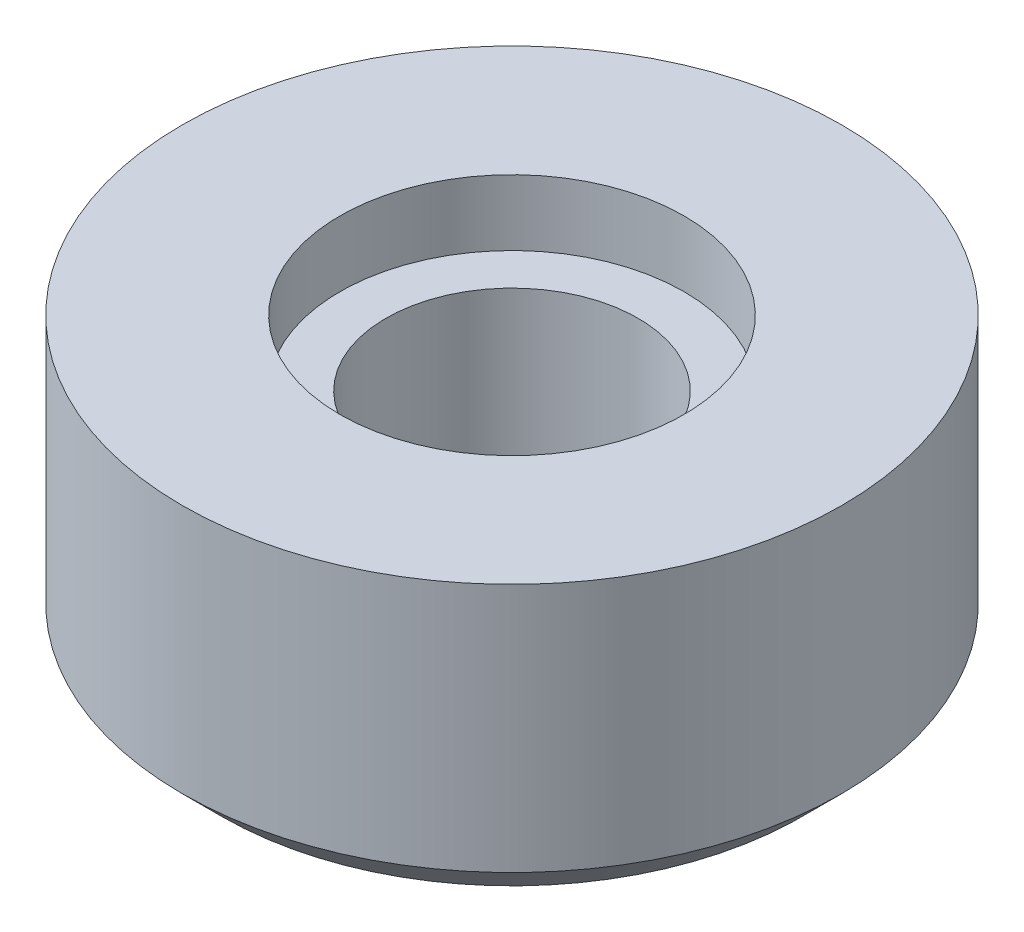
ISO-10303-21;
HEADER;
FILE_DESCRIPTION(('STEP AP214'),'2;1');
FILE_NAME('part.step','',(''),(''),'','','');
FILE_SCHEMA(('AUTOMOTIVE_DESIGN { 1 0 10303 214 1 1 1 1 }'));
ENDSEC;
DATA;
#1=APPLICATION_CONTEXT('core data for automotive mechanical design processes');
#2=APPLICATION_PROTOCOL_DEFINITION('international standard','automotive_design',2000,#1);
#3=PRODUCT_CONTEXT('',#1,'mechanical');
#4=PRODUCT('Part','Part','',(#3));
#5=PRODUCT_RELATED_PRODUCT_CATEGORY('part','',(#4));
#6=PRODUCT_DEFINITION_FORMATION('','',#4);
#7=PRODUCT_DEFINITION_CONTEXT('part definition',#1,'design');
#8=PRODUCT_DEFINITION('design','',#6,#7);
#9=PRODUCT_DEFINITION_SHAPE('','',#8);
#10=(LENGTH_UNIT() NAMED_UNIT(*) SI_UNIT(.MILLI.,.METRE.));
#11=(NAMED_UNIT(*) PLANE_ANGLE_UNIT() SI_UNIT($,.RADIAN.));
#12=(NAMED_UNIT(*) SI_UNIT($,.STERADIAN.) SOLID_ANGLE_UNIT());
#13=UNCERTAINTY_MEASURE_WITH_UNIT(LENGTH_MEASURE(1.E-05),#10,'distance_accuracy_value','');
#14=(GEOMETRIC_REPRESENTATION_CONTEXT(3) GLOBAL_UNCERTAINTY_ASSIGNED_CONTEXT((#13)) GLOBAL_UNIT_ASSIGNED_CONTEXT((#10,
#11,#12)) REPRESENTATION_CONTEXT('',''));
#15=CARTESIAN_POINT('',(0.,0.,0.));
#16=DIRECTION('',(0.,0.,1.));
#17=DIRECTION('',(1.,0.,0.));
#18=AXIS2_PLACEMENT_3D('',#15,#16,#17);
#19=CARTESIAN_POINT('',(0.,14.4550387124949,0.));
#20=DIRECTION('',(0.,1.,0.));
#21=DIRECTION('',(0.,0.,1.));
#22=AXIS2_PLACEMENT_3D('',#19,#20,#21);
#23=CYLINDRICAL_SURFACE('',#22,4.8);
#24=CARTESIAN_POINT('',(0.,0.,0.));
#25=DIRECTION('',(0.,1.,0.));
#26=DIRECTION('',(0.,0.,1.));
#27=AXIS2_PLACEMENT_3D('',#24,#25,#26);
#28=CIRCLE('',#27,4.8);
#29=CARTESIAN_POINT('',(0.,0.,4.8));
#30=VERTEX_POINT('',#29);
#31=EDGE_CURVE('E10',#30,#30,#28,.T.);
#32=ORIENTED_EDGE('',*,*,#31,.F.);
#33=EDGE_LOOP('',(#32));
#34=FACE_BOUND('',#33,.T.);
#35=CARTESIAN_POINT('',(0.,8.5,0.));
#36=DIRECTION('',(0.,1.,0.));
#37=DIRECTION('',(0.,0.,1.));
#38=AXIS2_PLACEMENT_3D('',#35,#36,#37);
#39=CIRCLE('',#38,4.8);
#40=CARTESIAN_POINT('',(0.,8.5,4.8));
#41=VERTEX_POINT('',#40);
#42=EDGE_CURVE('E59',#41,#41,#39,.T.);
#43=ORIENTED_EDGE('',*,*,#42,.T.);
#44=EDGE_LOOP('',(#43));
#45=FACE_BOUND('',#44,.T.);
#46=ADVANCED_FACE('F34',(#34,#45),#23,.F.);
#47=CARTESIAN_POINT('',(4.8,0.,0.));
#48=DIRECTION('',(0.,1.,0.));
#49=DIRECTION('',(0.,0.,1.));
#50=AXIS2_PLACEMENT_3D('',#47,#48,#49);
#51=PLANE('',#50);
#52=CARTESIAN_POINT('',(0.,0.,0.));
#53=DIRECTION('',(0.,1.,0.));
#54=DIRECTION('',(0.,0.,1.));
#55=AXIS2_PLACEMENT_3D('',#52,#53,#54);
#56=CIRCLE('',#55,11.05);
#57=CARTESIAN_POINT('',(0.,0.,11.05));
#58=VERTEX_POINT('',#57);
#59=EDGE_CURVE('E40',#58,#58,#56,.T.);
#60=ORIENTED_EDGE('',*,*,#59,.F.);
#61=EDGE_LOOP('',(#60));
#62=FACE_BOUND('',#61,.T.);
#63=ORIENTED_EDGE('',*,*,#31,.T.);
#64=EDGE_LOOP('',(#63));
#65=FACE_BOUND('',#64,.T.);
#66=ADVANCED_FACE('F90',(#62,#65),#51,.F.);
#67=CARTESIAN_POINT('',(0.,0.,0.));
#68=DIRECTION('',(0.,1.,0.));
#69=DIRECTION('',(0.,0.,1.));
#70=AXIS2_PLACEMENT_3D('',#67,#68,#69);
#71=CONICAL_SURFACE('',#70,11.05,0.785398163397448);
#72=CARTESIAN_POINT('',(0.,1.5,0.));
#73=DIRECTION('',(0.,1.,0.));
#74=DIRECTION('',(0.,0.,1.));
#75=AXIS2_PLACEMENT_3D('',#72,#73,#74);
#76=CIRCLE('',#75,12.55);
#77=CARTESIAN_POINT('',(0.,1.5,12.55));
#78=VERTEX_POINT('',#77);
#79=EDGE_CURVE('E44',#78,#78,#76,.T.);
#80=ORIENTED_EDGE('',*,*,#79,.F.);
#81=EDGE_LOOP('',(#80));
#82=FACE_BOUND('',#81,.T.);
#83=ORIENTED_EDGE('',*,*,#59,.T.);
#84=EDGE_LOOP('',(#83));
#85=FACE_BOUND('',#84,.T.);
#86=ADVANCED_FACE('F85',(#82,#85),#71,.T.);
#87=CARTESIAN_POINT('',(0.,14.4550387124949,0.));
#88=DIRECTION('',(0.,1.,0.));
#89=DIRECTION('',(0.,0.,1.));
#90=AXIS2_PLACEMENT_3D('',#87,#88,#89);
#91=CYLINDRICAL_SURFACE('',#90,12.55);
#92=CARTESIAN_POINT('',(0.,11.,0.));
#93=DIRECTION('',(0.,1.,0.));
#94=DIRECTION('',(0.,0.,1.));
#95=AXIS2_PLACEMENT_3D('',#92,#93,#94);
#96=CIRCLE('',#95,12.55);
#97=CARTESIAN_POINT('',(0.,11.,12.55));
#98=VERTEX_POINT('',#97);
#99=EDGE_CURVE('E48',#98,#98,#96,.T.);
#100=ORIENTED_EDGE('',*,*,#99,.F.);
#101=EDGE_LOOP('',(#100));
#102=FACE_BOUND('',#101,.T.);
#103=ORIENTED_EDGE('',*,*,#79,.T.);
#104=EDGE_LOOP('',(#103));
#105=FACE_BOUND('',#104,.T.);
#106=ADVANCED_FACE('F79',(#102,#105),#91,.T.);
#107=CARTESIAN_POINT('',(12.55,11.,0.));
#108=DIRECTION('',(0.,-1.,0.));
#109=DIRECTION('',(0.,0.,-1.));
#110=AXIS2_PLACEMENT_3D('',#107,#108,#109);
#111=PLANE('',#110);
#112=CARTESIAN_POINT('',(0.,11.,0.));
#113=DIRECTION('',(0.,1.,0.));
#114=DIRECTION('',(0.,0.,1.));
#115=AXIS2_PLACEMENT_3D('',#112,#113,#114);
#116=CIRCLE('',#115,6.55);
#117=CARTESIAN_POINT('',(0.,11.,6.55));
#118=VERTEX_POINT('',#117);
#119=EDGE_CURVE('E53',#118,#118,#116,.T.);
#120=ORIENTED_EDGE('',*,*,#119,.F.);
#121=EDGE_LOOP('',(#120));
#122=FACE_BOUND('',#121,.T.);
#123=ORIENTED_EDGE('',*,*,#99,.T.);
#124=EDGE_LOOP('',(#123));
#125=FACE_BOUND('',#124,.T.);
#126=ADVANCED_FACE('F73',(#122,#125),#111,.F.);
#127=CARTESIAN_POINT('',(0.,14.4550387124949,0.));
#128=DIRECTION('',(0.,1.,0.));
#129=DIRECTION('',(0.,0.,1.));
#130=AXIS2_PLACEMENT_3D('',#127,#128,#129);
#131=CYLINDRICAL_SURFACE('',#130,6.55);
#132=CARTESIAN_POINT('',(0.,8.5,0.));
#133=DIRECTION('',(0.,1.,0.));
#134=DIRECTION('',(0.,0.,1.));
#135=AXIS2_PLACEMENT_3D('',#132,#133,#134);
#136=CIRCLE('',#135,6.54999999999999);
#137=CARTESIAN_POINT('',(0.,8.5,6.54999999999999));
#138=VERTEX_POINT('',#137);
#139=EDGE_CURVE('E56',#138,#138,#136,.T.);
#140=ORIENTED_EDGE('',*,*,#139,.F.);
#141=EDGE_LOOP('',(#140));
#142=FACE_BOUND('',#141,.T.);
#143=ORIENTED_EDGE('',*,*,#119,.T.);
#144=EDGE_LOOP('',(#143));
#145=FACE_BOUND('',#144,.T.);
#146=ADVANCED_FACE('F67',(#142,#145),#131,.F.);
#147=CARTESIAN_POINT('',(6.54999999999999,8.5,0.));
#148=DIRECTION('',(0.,-1.,0.));
#149=DIRECTION('',(0.,0.,-1.));
#150=AXIS2_PLACEMENT_3D('',#147,#148,#149);
#151=PLANE('',#150);
#152=ORIENTED_EDGE('',*,*,#42,.F.);
#153=EDGE_LOOP('',(#152));
#154=FACE_BOUND('',#153,.T.);
#155=ORIENTED_EDGE('',*,*,#139,.T.);
#156=EDGE_LOOP('',(#155));
#157=FACE_BOUND('',#156,.T.);
#158=ADVANCED_FACE('F64',(#154,#157),#151,.F.);
#159=CLOSED_SHELL('',(#46,#66,#86,#106,#126,#146,#158));
#160=MANIFOLD_SOLID_BREP('B2',#159);
#161=ADVANCED_BREP_SHAPE_REPRESENTATION('',(#18,#160),#14);
#162=SHAPE_DEFINITION_REPRESENTATION(#9,#161);
ENDSEC;
END-ISO-10303-21;
